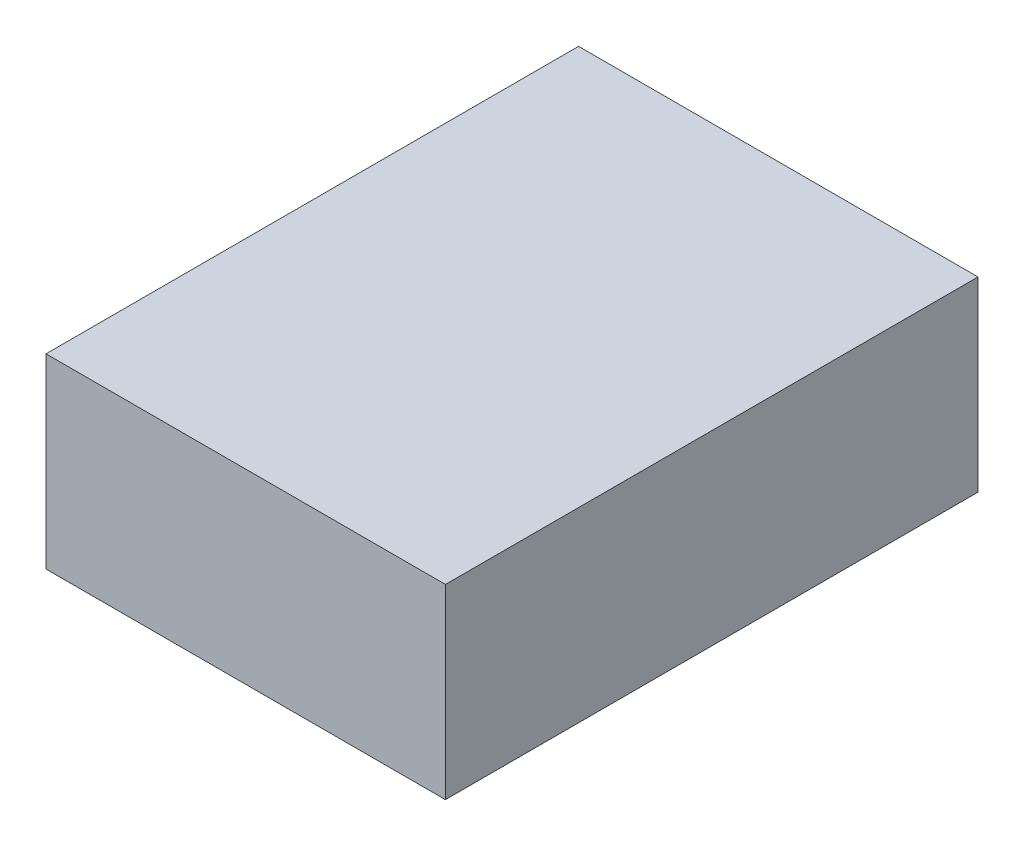
ISO-10303-21;
HEADER;
FILE_DESCRIPTION(('STEP AP214'),'2;1');
FILE_NAME('part.step','',(''),(''),'','','');
FILE_SCHEMA(('AUTOMOTIVE_DESIGN { 1 0 10303 214 1 1 1 1 }'));
ENDSEC;
DATA;
#1=APPLICATION_CONTEXT('core data for automotive mechanical design processes');
#2=APPLICATION_PROTOCOL_DEFINITION('international standard','automotive_design',2000,#1);
#3=PRODUCT_CONTEXT('',#1,'mechanical');
#4=PRODUCT('Part','Part','',(#3));
#5=PRODUCT_RELATED_PRODUCT_CATEGORY('part','',(#4));
#6=PRODUCT_DEFINITION_FORMATION('','',#4);
#7=PRODUCT_DEFINITION_CONTEXT('part definition',#1,'design');
#8=PRODUCT_DEFINITION('design','',#6,#7);
#9=PRODUCT_DEFINITION_SHAPE('','',#8);
#10=(LENGTH_UNIT() NAMED_UNIT(*) SI_UNIT(.MILLI.,.METRE.));
#11=(NAMED_UNIT(*) PLANE_ANGLE_UNIT() SI_UNIT($,.RADIAN.));
#12=(NAMED_UNIT(*) SI_UNIT($,.STERADIAN.) SOLID_ANGLE_UNIT());
#13=UNCERTAINTY_MEASURE_WITH_UNIT(LENGTH_MEASURE(1.E-05),#10,'distance_accuracy_value','');
#14=(GEOMETRIC_REPRESENTATION_CONTEXT(3) GLOBAL_UNCERTAINTY_ASSIGNED_CONTEXT((#13)) GLOBAL_UNIT_ASSIGNED_CONTEXT((#10,
#11,#12)) REPRESENTATION_CONTEXT('',''));
#15=CARTESIAN_POINT('',(0.,0.,0.));
#16=DIRECTION('',(0.,0.,1.));
#17=DIRECTION('',(1.,0.,0.));
#18=AXIS2_PLACEMENT_3D('',#15,#16,#17);
#19=CARTESIAN_POINT('',(75.0000000000001,70.,-100.));
#20=DIRECTION('',(-1.,0.,0.));
#21=DIRECTION('',(0.,0.,1.));
#22=AXIS2_PLACEMENT_3D('',#19,#20,#21);
#23=PLANE('',#22);
#24=DIRECTION('',(0.,0.,-1.));
#25=VECTOR('',#24,1.);
#26=CARTESIAN_POINT('',(75.0000000000001,0.,-100.));
#27=LINE('',#26,#25);
#28=CARTESIAN_POINT('',(75.0000000000001,0.,99.9999999999999));
#29=VERTEX_POINT('',#28);
#30=CARTESIAN_POINT('',(75.0000000000001,0.,-100.));
#31=VERTEX_POINT('',#30);
#32=EDGE_CURVE('E96',#29,#31,#27,.T.);
#33=ORIENTED_EDGE('',*,*,#32,.T.);
#34=DIRECTION('',(0.,-1.,0.));
#35=VECTOR('',#34,1.);
#36=CARTESIAN_POINT('',(75.0000000000001,70.,-100.));
#37=LINE('',#36,#35);
#38=CARTESIAN_POINT('',(75.0000000000001,70.,-100.));
#39=VERTEX_POINT('',#38);
#40=EDGE_CURVE('E11',#39,#31,#37,.T.);
#41=ORIENTED_EDGE('',*,*,#40,.F.);
#42=DIRECTION('',(0.,0.,-1.));
#43=VECTOR('',#42,1.);
#44=CARTESIAN_POINT('',(75.0000000000001,70.,-100.));
#45=LINE('',#44,#43);
#46=CARTESIAN_POINT('',(75.0000000000001,70.,99.9999999999999));
#47=VERTEX_POINT('',#46);
#48=EDGE_CURVE('E84',#47,#39,#45,.T.);
#49=ORIENTED_EDGE('',*,*,#48,.F.);
#50=DIRECTION('',(0.,-1.,0.));
#51=VECTOR('',#50,1.);
#52=CARTESIAN_POINT('',(75.0000000000001,70.,99.9999999999999));
#53=LINE('',#52,#51);
#54=EDGE_CURVE('E92',#47,#29,#53,.T.);
#55=ORIENTED_EDGE('',*,*,#54,.T.);
#56=EDGE_LOOP('',(#33,#41,#49,#55));
#57=FACE_BOUND('',#56,.T.);
#58=ADVANCED_FACE('F33',(#57),#23,.F.);
#59=CARTESIAN_POINT('',(-75.,70.,-100.));
#60=DIRECTION('',(0.,0.,1.));
#61=DIRECTION('',(1.,0.,0.));
#62=AXIS2_PLACEMENT_3D('',#59,#60,#61);
#63=PLANE('',#62);
#64=DIRECTION('',(-1.,0.,0.));
#65=VECTOR('',#64,1.);
#66=CARTESIAN_POINT('',(-75.,0.,-100.));
#67=LINE('',#66,#65);
#68=CARTESIAN_POINT('',(-75.,0.,-100.));
#69=VERTEX_POINT('',#68);
#70=EDGE_CURVE('E88',#31,#69,#67,.T.);
#71=ORIENTED_EDGE('',*,*,#70,.T.);
#72=DIRECTION('',(0.,-1.,0.));
#73=VECTOR('',#72,1.);
#74=CARTESIAN_POINT('',(-75.,70.,-100.));
#75=LINE('',#74,#73);
#76=CARTESIAN_POINT('',(-75.,70.,-100.));
#77=VERTEX_POINT('',#76);
#78=EDGE_CURVE('E41',#77,#69,#75,.T.);
#79=ORIENTED_EDGE('',*,*,#78,.F.);
#80=DIRECTION('',(-1.,0.,0.));
#81=VECTOR('',#80,1.);
#82=CARTESIAN_POINT('',(-75.,70.,-100.));
#83=LINE('',#82,#81);
#84=EDGE_CURVE('E79',#39,#77,#83,.T.);
#85=ORIENTED_EDGE('',*,*,#84,.F.);
#86=ORIENTED_EDGE('',*,*,#40,.T.);
#87=EDGE_LOOP('',(#71,#79,#85,#86));
#88=FACE_BOUND('',#87,.T.);
#89=ADVANCED_FACE('F87',(#88),#63,.F.);
#90=CARTESIAN_POINT('',(-75.,70.,-100.));
#91=DIRECTION('',(1.,0.,0.));
#92=DIRECTION('',(0.,0.,-1.));
#93=AXIS2_PLACEMENT_3D('',#90,#91,#92);
#94=PLANE('',#93);
#95=DIRECTION('',(0.,0.,1.));
#96=VECTOR('',#95,1.);
#97=CARTESIAN_POINT('',(-75.,0.,-100.));
#98=LINE('',#97,#96);
#99=CARTESIAN_POINT('',(-74.9999999999999,0.,99.9999999999999));
#100=VERTEX_POINT('',#99);
#101=EDGE_CURVE('E66',#69,#100,#98,.T.);
#102=ORIENTED_EDGE('',*,*,#101,.T.);
#103=DIRECTION('',(0.,-1.,0.));
#104=VECTOR('',#103,1.);
#105=CARTESIAN_POINT('',(-74.9999999999999,70.,99.9999999999999));
#106=LINE('',#105,#104);
#107=CARTESIAN_POINT('',(-74.9999999999999,70.,99.9999999999999));
#108=VERTEX_POINT('',#107);
#109=EDGE_CURVE('E89',#108,#100,#106,.T.);
#110=ORIENTED_EDGE('',*,*,#109,.F.);
#111=DIRECTION('',(0.,0.,1.));
#112=VECTOR('',#111,1.);
#113=CARTESIAN_POINT('',(-75.,70.,-100.));
#114=LINE('',#113,#112);
#115=EDGE_CURVE('E82',#77,#108,#114,.T.);
#116=ORIENTED_EDGE('',*,*,#115,.F.);
#117=ORIENTED_EDGE('',*,*,#78,.T.);
#118=EDGE_LOOP('',(#102,#110,#116,#117));
#119=FACE_BOUND('',#118,.T.);
#120=ADVANCED_FACE('F90',(#119),#94,.F.);
#121=CARTESIAN_POINT('',(-74.9999999999999,70.,99.9999999999999));
#122=DIRECTION('',(0.,0.,-1.));
#123=DIRECTION('',(-1.,0.,0.));
#124=AXIS2_PLACEMENT_3D('',#121,#122,#123);
#125=PLANE('',#124);
#126=DIRECTION('',(1.,0.,0.));
#127=VECTOR('',#126,1.);
#128=CARTESIAN_POINT('',(-74.9999999999999,0.,99.9999999999999));
#129=LINE('',#128,#127);
#130=EDGE_CURVE('E72',#100,#29,#129,.T.);
#131=ORIENTED_EDGE('',*,*,#130,.T.);
#132=ORIENTED_EDGE('',*,*,#54,.F.);
#133=DIRECTION('',(1.,0.,0.));
#134=VECTOR('',#133,1.);
#135=CARTESIAN_POINT('',(-74.9999999999999,70.,99.9999999999999));
#136=LINE('',#135,#134);
#137=EDGE_CURVE('E49',#108,#47,#136,.T.);
#138=ORIENTED_EDGE('',*,*,#137,.F.);
#139=ORIENTED_EDGE('',*,*,#109,.T.);
#140=EDGE_LOOP('',(#131,#132,#138,#139));
#141=FACE_BOUND('',#140,.T.);
#142=ADVANCED_FACE('F103',(#141),#125,.F.);
#143=CARTESIAN_POINT('',(0.,70.,0.));
#144=DIRECTION('',(0.,1.,0.));
#145=DIRECTION('',(0.,0.,1.));
#146=AXIS2_PLACEMENT_3D('',#143,#144,#145);
#147=PLANE('',#146);
#148=ORIENTED_EDGE('',*,*,#48,.T.);
#149=ORIENTED_EDGE('',*,*,#84,.T.);
#150=ORIENTED_EDGE('',*,*,#115,.T.);
#151=ORIENTED_EDGE('',*,*,#137,.T.);
#152=EDGE_LOOP('',(#148,#149,#150,#151));
#153=FACE_BOUND('',#152,.T.);
#154=ADVANCED_FACE('F80',(#153),#147,.T.);
#155=CARTESIAN_POINT('',(0.,0.,0.));
#156=DIRECTION('',(0.,1.,0.));
#157=DIRECTION('',(0.,0.,1.));
#158=AXIS2_PLACEMENT_3D('',#155,#156,#157);
#159=PLANE('',#158);
#160=ORIENTED_EDGE('',*,*,#32,.F.);
#161=ORIENTED_EDGE('',*,*,#130,.F.);
#162=ORIENTED_EDGE('',*,*,#101,.F.);
#163=ORIENTED_EDGE('',*,*,#70,.F.);
#164=EDGE_LOOP('',(#160,#161,#162,#163));
#165=FACE_BOUND('',#164,.T.);
#166=ADVANCED_FACE('F106',(#165),#159,.F.);
#167=CLOSED_SHELL('',(#58,#89,#120,#142,#154,#166));
#168=MANIFOLD_SOLID_BREP('B2',#167);
#169=ADVANCED_BREP_SHAPE_REPRESENTATION('',(#18,#168),#14);
#170=SHAPE_DEFINITION_REPRESENTATION(#9,#169);
ENDSEC;
END-ISO-10303-21;
